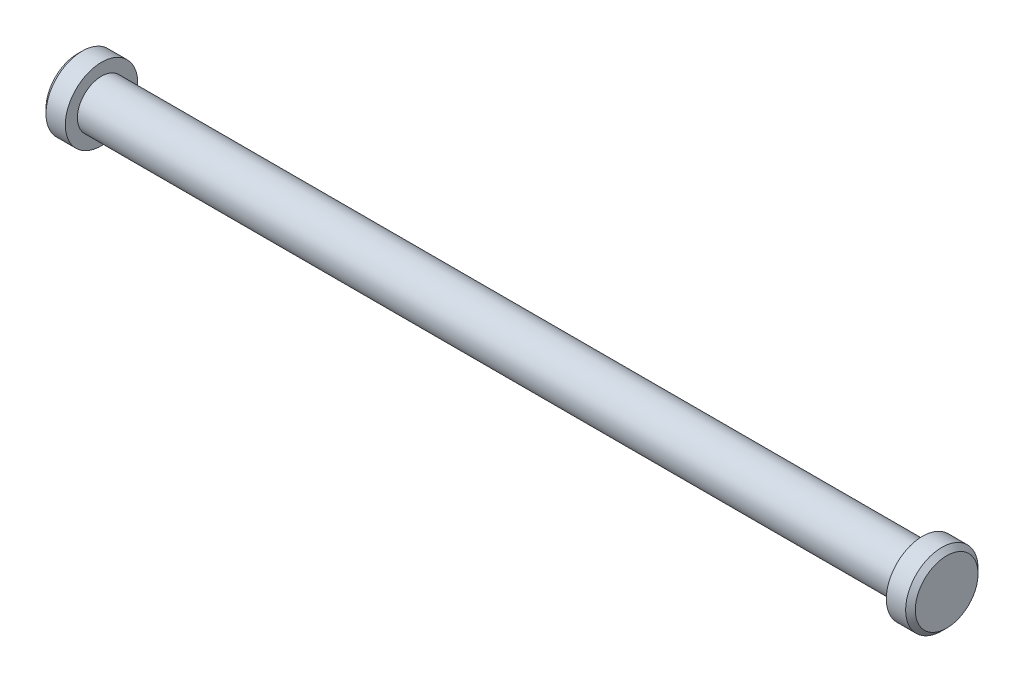
ISO-10303-21;
HEADER;
FILE_DESCRIPTION(('STEP AP214'),'2;1');
FILE_NAME('part.step','',(''),(''),'','','');
FILE_SCHEMA(('AUTOMOTIVE_DESIGN { 1 0 10303 214 1 1 1 1 }'));
ENDSEC;
DATA;
#1=APPLICATION_CONTEXT('core data for automotive mechanical design processes');
#2=APPLICATION_PROTOCOL_DEFINITION('international standard','automotive_design',2000,#1);
#3=PRODUCT_CONTEXT('',#1,'mechanical');
#4=PRODUCT('Part','Part','',(#3));
#5=PRODUCT_RELATED_PRODUCT_CATEGORY('part','',(#4));
#6=PRODUCT_DEFINITION_FORMATION('','',#4);
#7=PRODUCT_DEFINITION_CONTEXT('part definition',#1,'design');
#8=PRODUCT_DEFINITION('design','',#6,#7);
#9=PRODUCT_DEFINITION_SHAPE('','',#8);
#10=(LENGTH_UNIT() NAMED_UNIT(*) SI_UNIT(.MILLI.,.METRE.));
#11=(NAMED_UNIT(*) PLANE_ANGLE_UNIT() SI_UNIT($,.RADIAN.));
#12=(NAMED_UNIT(*) SI_UNIT($,.STERADIAN.) SOLID_ANGLE_UNIT());
#13=UNCERTAINTY_MEASURE_WITH_UNIT(LENGTH_MEASURE(1.E-05),#10,'distance_accuracy_value','');
#14=(GEOMETRIC_REPRESENTATION_CONTEXT(3) GLOBAL_UNCERTAINTY_ASSIGNED_CONTEXT((#13)) GLOBAL_UNIT_ASSIGNED_CONTEXT((#10,
#11,#12)) REPRESENTATION_CONTEXT('',''));
#15=CARTESIAN_POINT('',(0.,0.,0.));
#16=DIRECTION('',(0.,0.,1.));
#17=DIRECTION('',(1.,0.,0.));
#18=AXIS2_PLACEMENT_3D('',#15,#16,#17);
#19=CARTESIAN_POINT('',(-34.29,0.,0.));
#20=DIRECTION('',(1.,0.,0.));
#21=DIRECTION('',(0.,0.,-1.));
#22=AXIS2_PLACEMENT_3D('',#19,#20,#21);
#23=PLANE('',#22);
#24=CARTESIAN_POINT('',(-34.29,0.,0.));
#25=DIRECTION('',(1.,0.,0.));
#26=DIRECTION('',(0.,0.,-1.));
#27=AXIS2_PLACEMENT_3D('',#24,#25,#26);
#28=CIRCLE('',#27,2.47649999999999);
#29=CARTESIAN_POINT('',(-34.29,0.,-2.47649999999999));
#30=VERTEX_POINT('',#29);
#31=EDGE_CURVE('E52',#30,#30,#28,.F.);
#32=ORIENTED_EDGE('',*,*,#31,.T.);
#33=EDGE_LOOP('',(#32));
#34=FACE_BOUND('',#33,.T.);
#35=ADVANCED_FACE('F37',(#34),#23,.F.);
#36=CARTESIAN_POINT('',(-34.29,0.,0.));
#37=DIRECTION('',(-1.,0.,0.));
#38=DIRECTION('',(0.,0.,1.));
#39=AXIS2_PLACEMENT_3D('',#36,#37,#38);
#40=CYLINDRICAL_SURFACE('',#39,2.8575);
#41=CARTESIAN_POINT('',(-33.909,0.,0.));
#42=DIRECTION('',(1.,0.,0.));
#43=DIRECTION('',(0.,0.,-1.));
#44=AXIS2_PLACEMENT_3D('',#41,#42,#43);
#45=CIRCLE('',#44,2.8575);
#46=CARTESIAN_POINT('',(-33.909,0.,-2.8575));
#47=VERTEX_POINT('',#46);
#48=EDGE_CURVE('E48',#47,#47,#45,.T.);
#49=ORIENTED_EDGE('',*,*,#48,.T.);
#50=EDGE_LOOP('',(#49));
#51=FACE_BOUND('',#50,.T.);
#52=CARTESIAN_POINT('',(-32.385,0.,0.));
#53=DIRECTION('',(-1.,0.,0.));
#54=DIRECTION('',(0.,0.,1.));
#55=AXIS2_PLACEMENT_3D('',#52,#53,#54);
#56=CIRCLE('',#55,2.8575);
#57=CARTESIAN_POINT('',(-32.385,0.,2.8575));
#58=VERTEX_POINT('',#57);
#59=EDGE_CURVE('E57',#58,#58,#56,.T.);
#60=ORIENTED_EDGE('',*,*,#59,.T.);
#61=EDGE_LOOP('',(#60));
#62=FACE_BOUND('',#61,.T.);
#63=ADVANCED_FACE('F86',(#51,#62),#40,.T.);
#64=CARTESIAN_POINT('',(-32.385,2.8575,0.));
#65=DIRECTION('',(-1.,0.,0.));
#66=DIRECTION('',(0.,0.,1.));
#67=AXIS2_PLACEMENT_3D('',#64,#65,#66);
#68=PLANE('',#67);
#69=ORIENTED_EDGE('',*,*,#59,.F.);
#70=EDGE_LOOP('',(#69));
#71=FACE_BOUND('',#70,.T.);
#72=CARTESIAN_POINT('',(-32.385,0.,0.));
#73=DIRECTION('',(-1.,0.,0.));
#74=DIRECTION('',(0.,0.,1.));
#75=AXIS2_PLACEMENT_3D('',#72,#73,#74);
#76=CIRCLE('',#75,1.905);
#77=CARTESIAN_POINT('',(-32.385,0.,1.905));
#78=VERTEX_POINT('',#77);
#79=EDGE_CURVE('E60',#78,#78,#76,.T.);
#80=ORIENTED_EDGE('',*,*,#79,.T.);
#81=EDGE_LOOP('',(#80));
#82=FACE_BOUND('',#81,.T.);
#83=ADVANCED_FACE('F92',(#71,#82),#68,.F.);
#84=CARTESIAN_POINT('',(-34.29,0.,0.));
#85=DIRECTION('',(-1.,0.,0.));
#86=DIRECTION('',(0.,0.,1.));
#87=AXIS2_PLACEMENT_3D('',#84,#85,#86);
#88=CYLINDRICAL_SURFACE('',#87,1.905);
#89=ORIENTED_EDGE('',*,*,#79,.F.);
#90=EDGE_LOOP('',(#89));
#91=FACE_BOUND('',#90,.T.);
#92=CARTESIAN_POINT('',(32.385,0.,0.));
#93=DIRECTION('',(-1.,0.,0.));
#94=DIRECTION('',(0.,0.,1.));
#95=AXIS2_PLACEMENT_3D('',#92,#93,#94);
#96=CIRCLE('',#95,1.905);
#97=CARTESIAN_POINT('',(32.385,0.,1.905));
#98=VERTEX_POINT('',#97);
#99=EDGE_CURVE('E63',#98,#98,#96,.T.);
#100=ORIENTED_EDGE('',*,*,#99,.T.);
#101=EDGE_LOOP('',(#100));
#102=FACE_BOUND('',#101,.T.);
#103=ADVANCED_FACE('F82',(#91,#102),#88,.T.);
#104=CARTESIAN_POINT('',(32.385,1.905,0.));
#105=DIRECTION('',(1.,0.,0.));
#106=DIRECTION('',(0.,0.,-1.));
#107=AXIS2_PLACEMENT_3D('',#104,#105,#106);
#108=PLANE('',#107);
#109=ORIENTED_EDGE('',*,*,#99,.F.);
#110=EDGE_LOOP('',(#109));
#111=FACE_BOUND('',#110,.T.);
#112=CARTESIAN_POINT('',(32.385,0.,0.));
#113=DIRECTION('',(-1.,0.,0.));
#114=DIRECTION('',(0.,0.,1.));
#115=AXIS2_PLACEMENT_3D('',#112,#113,#114);
#116=CIRCLE('',#115,2.8575);
#117=CARTESIAN_POINT('',(32.385,0.,2.8575));
#118=VERTEX_POINT('',#117);
#119=EDGE_CURVE('E66',#118,#118,#116,.T.);
#120=ORIENTED_EDGE('',*,*,#119,.T.);
#121=EDGE_LOOP('',(#120));
#122=FACE_BOUND('',#121,.T.);
#123=ADVANCED_FACE('F70',(#111,#122),#108,.F.);
#124=CARTESIAN_POINT('',(-34.29,0.,0.));
#125=DIRECTION('',(-1.,0.,0.));
#126=DIRECTION('',(0.,0.,1.));
#127=AXIS2_PLACEMENT_3D('',#124,#125,#126);
#128=CYLINDRICAL_SURFACE('',#127,2.8575);
#129=CARTESIAN_POINT('',(33.909,0.,0.));
#130=DIRECTION('',(-1.,0.,0.));
#131=DIRECTION('',(0.,0.,1.));
#132=AXIS2_PLACEMENT_3D('',#129,#130,#131);
#133=CIRCLE('',#132,2.8575);
#134=CARTESIAN_POINT('',(33.909,0.,2.8575));
#135=VERTEX_POINT('',#134);
#136=EDGE_CURVE('E44',#135,#135,#133,.T.);
#137=ORIENTED_EDGE('',*,*,#136,.T.);
#138=EDGE_LOOP('',(#137));
#139=FACE_BOUND('',#138,.T.);
#140=ORIENTED_EDGE('',*,*,#119,.F.);
#141=EDGE_LOOP('',(#140));
#142=FACE_BOUND('',#141,.T.);
#143=ADVANCED_FACE('F72',(#139,#142),#128,.T.);
#144=CARTESIAN_POINT('',(34.29,2.8575,0.));
#145=DIRECTION('',(-1.,0.,0.));
#146=DIRECTION('',(0.,0.,1.));
#147=AXIS2_PLACEMENT_3D('',#144,#145,#146);
#148=PLANE('',#147);
#149=CARTESIAN_POINT('',(34.29,0.,0.));
#150=DIRECTION('',(-1.,0.,0.));
#151=DIRECTION('',(0.,0.,1.));
#152=AXIS2_PLACEMENT_3D('',#149,#150,#151);
#153=CIRCLE('',#152,2.47649999999999);
#154=CARTESIAN_POINT('',(34.29,0.,2.47649999999999));
#155=VERTEX_POINT('',#154);
#156=EDGE_CURVE('E10',#155,#155,#153,.F.);
#157=ORIENTED_EDGE('',*,*,#156,.T.);
#158=EDGE_LOOP('',(#157));
#159=FACE_BOUND('',#158,.T.);
#160=ADVANCED_FACE('F74',(#159),#148,.F.);
#161=CARTESIAN_POINT('',(-34.29,0.,0.));
#162=DIRECTION('',(1.,0.,0.));
#163=DIRECTION('',(0.,0.,-1.));
#164=AXIS2_PLACEMENT_3D('',#161,#162,#163);
#165=CONICAL_SURFACE('',#164,2.47649999999999,0.785398163397446);
#166=ORIENTED_EDGE('',*,*,#48,.F.);
#167=EDGE_LOOP('',(#166));
#168=FACE_BOUND('',#167,.T.);
#169=ORIENTED_EDGE('',*,*,#31,.F.);
#170=EDGE_LOOP('',(#169));
#171=FACE_BOUND('',#170,.T.);
#172=ADVANCED_FACE('F80',(#168,#171),#165,.T.);
#173=CARTESIAN_POINT('',(33.909,0.,0.));
#174=DIRECTION('',(-1.,0.,0.));
#175=DIRECTION('',(0.,0.,1.));
#176=AXIS2_PLACEMENT_3D('',#173,#174,#175);
#177=CONICAL_SURFACE('',#176,2.8575,0.785398163397453);
#178=ORIENTED_EDGE('',*,*,#156,.F.);
#179=EDGE_LOOP('',(#178));
#180=FACE_BOUND('',#179,.T.);
#181=ORIENTED_EDGE('',*,*,#136,.F.);
#182=EDGE_LOOP('',(#181));
#183=FACE_BOUND('',#182,.T.);
#184=ADVANCED_FACE('F39',(#180,#183),#177,.T.);
#185=CLOSED_SHELL('',(#35,#63,#83,#103,#123,#143,#160,#172,#184));
#186=MANIFOLD_SOLID_BREP('B2',#185);
#187=ADVANCED_BREP_SHAPE_REPRESENTATION('',(#18,#186),#14);
#188=SHAPE_DEFINITION_REPRESENTATION(#9,#187);
ENDSEC;
END-ISO-10303-21;
